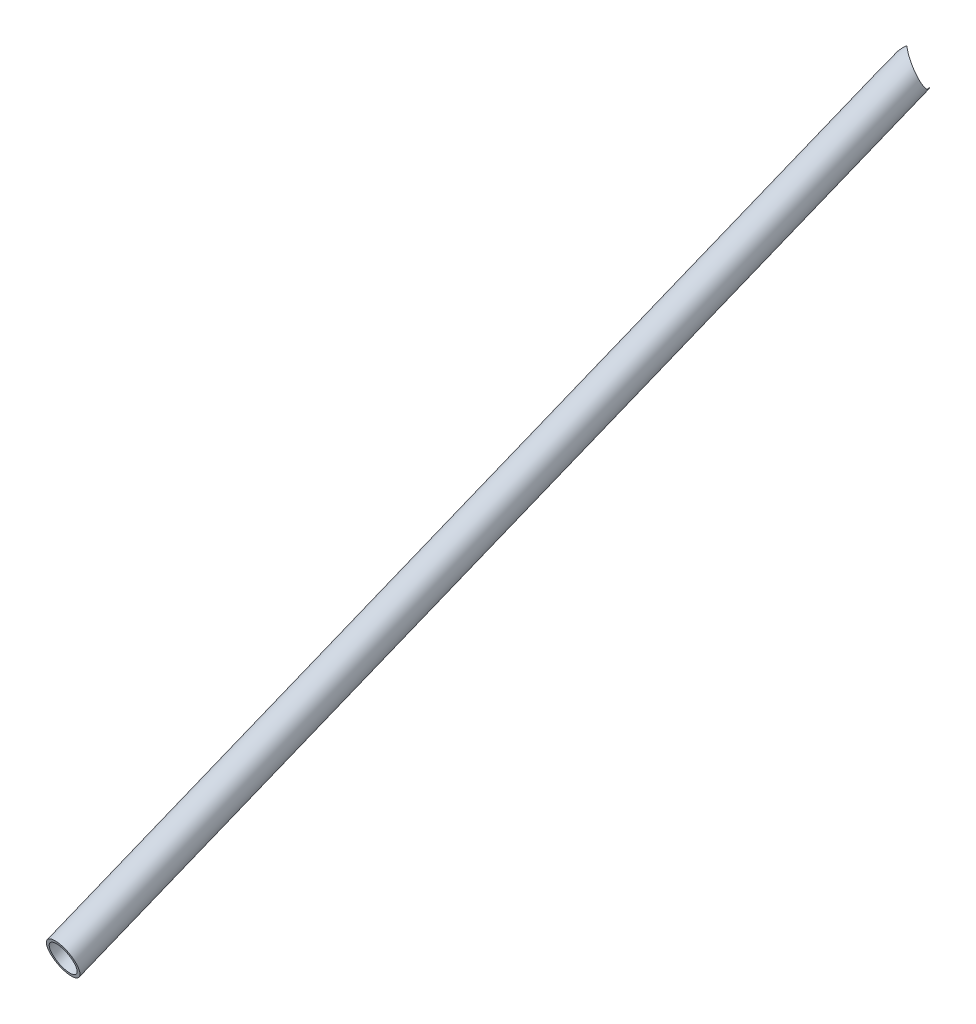
ISO-10303-21;
HEADER;
FILE_DESCRIPTION(('STEP AP214'),'2;1');
FILE_NAME('part.step','',(''),(''),'','','');
FILE_SCHEMA(('AUTOMOTIVE_DESIGN { 1 0 10303 214 1 1 1 1 }'));
ENDSEC;
DATA;
#1=APPLICATION_CONTEXT('core data for automotive mechanical design processes');
#2=APPLICATION_PROTOCOL_DEFINITION('international standard','automotive_design',2000,#1);
#3=PRODUCT_CONTEXT('',#1,'mechanical');
#4=PRODUCT('Part','Part','',(#3));
#5=PRODUCT_RELATED_PRODUCT_CATEGORY('part','',(#4));
#6=PRODUCT_DEFINITION_FORMATION('','',#4);
#7=PRODUCT_DEFINITION_CONTEXT('part definition',#1,'design');
#8=PRODUCT_DEFINITION('design','',#6,#7);
#9=PRODUCT_DEFINITION_SHAPE('','',#8);
#10=(LENGTH_UNIT() NAMED_UNIT(*) SI_UNIT(.MILLI.,.METRE.));
#11=(NAMED_UNIT(*) PLANE_ANGLE_UNIT() SI_UNIT($,.RADIAN.));
#12=(NAMED_UNIT(*) SI_UNIT($,.STERADIAN.) SOLID_ANGLE_UNIT());
#13=UNCERTAINTY_MEASURE_WITH_UNIT(LENGTH_MEASURE(1.E-05),#10,'distance_accuracy_value','');
#14=(GEOMETRIC_REPRESENTATION_CONTEXT(3) GLOBAL_UNCERTAINTY_ASSIGNED_CONTEXT((#13)) GLOBAL_UNIT_ASSIGNED_CONTEXT((#10,
#11,#12)) REPRESENTATION_CONTEXT('',''));
#15=CARTESIAN_POINT('',(0.,0.,0.));
#16=DIRECTION('',(0.,0.,1.));
#17=DIRECTION('',(1.,0.,0.));
#18=AXIS2_PLACEMENT_3D('',#15,#16,#17);
#19=CARTESIAN_POINT('',(-80.,380.,-601.037933611912));
#20=DIRECTION('',(-0.125768324689571,0.215602842324979,-0.968347945155133));
#21=DIRECTION('',(0.,0.976098519192531,0.21732850901377));
#22=AXIS2_PLACEMENT_3D('',#19,#20,#21);
#23=CYLINDRICAL_SURFACE('',#22,7.9);
#24=CARTESIAN_POINT('',(-149.209076931173,506.355310183633,-1132.19342575695));
#25=CARTESIAN_POINT('',(-148.945397748748,506.335164156304,-1132.10292983534));
#26=CARTESIAN_POINT('',(-148.683483917305,506.302315775724,-1132.00985622841));
#27=CARTESIAN_POINT('',(-148.163566693941,506.213375160184,-1131.8234688328));
#28=CARTESIAN_POINT('',(-147.905567175437,506.157261283191,-1131.7301549011));
#29=CARTESIAN_POINT('',(-147.393150377631,506.0227927718,-1131.54684993696));
#30=CARTESIAN_POINT('',(-147.138748464778,505.944362332052,-1131.45687143248));
#31=CARTESIAN_POINT('',(-146.635270418867,505.765996660557,-1131.28389953262));
#32=CARTESIAN_POINT('',(-146.38619192179,505.666071202015,-1131.20090298649));
#33=CARTESIAN_POINT('',(-145.935804247323,505.463536693041,-1131.05796775222));
#34=CARTESIAN_POINT('',(-145.733504917796,505.364203929144,-1130.99649852533));
#35=CARTESIAN_POINT('',(-145.334315271058,505.150854709887,-1130.88209634148));
#36=CARTESIAN_POINT('',(-145.137423943656,505.036841019806,-1130.82916178116));
#37=CARTESIAN_POINT('',(-144.750716376789,504.794450852289,-1130.73358029555));
#38=CARTESIAN_POINT('',(-144.560884871582,504.666108095893,-1130.69090993239));
#39=CARTESIAN_POINT('',(-144.18939505968,504.395019611466,-1130.61733841013));
#40=CARTESIAN_POINT('',(-144.007734821495,504.252277313281,-1130.58643445668));
#41=CARTESIAN_POINT('',(-143.689951671463,503.982889595417,-1130.54284101061));
#42=CARTESIAN_POINT('',(-143.552012361899,503.858771653067,-1130.52773952096));
#43=CARTESIAN_POINT('',(-143.283629265849,503.601965756527,-1130.50680881754));
#44=CARTESIAN_POINT('',(-143.153183799094,503.469279737755,-1130.50097751732));
#45=CARTESIAN_POINT('',(-142.900951024974,503.195880569679,-1130.49924839674));
#46=CARTESIAN_POINT('',(-142.779162086527,503.055168941632,-1130.50334869992));
#47=CARTESIAN_POINT('',(-142.545413655984,502.766437104493,-1130.52200663054));
#48=CARTESIAN_POINT('',(-142.433454280269,502.6184168089,-1130.53656438178));
#49=CARTESIAN_POINT('',(-142.21994845476,502.315188330065,-1130.57658944049));
#50=CARTESIAN_POINT('',(-142.118463599413,502.159944645185,-1130.60211717397));
#51=CARTESIAN_POINT('',(-141.927715379098,501.844229900909,-1130.66420029894));
#52=CARTESIAN_POINT('',(-141.838452033992,501.683758833018,-1130.70075570834));
#53=CARTESIAN_POINT('',(-141.673069237904,501.358973983735,-1130.78472601664));
#54=CARTESIAN_POINT('',(-141.59694707169,501.194661004143,-1130.83213866749));
#55=CARTESIAN_POINT('',(-141.458479748166,500.863601975269,-1130.93739959161));
#56=CARTESIAN_POINT('',(-141.396133788302,500.696856068323,-1130.99524725661));
#57=CARTESIAN_POINT('',(-141.290531241945,500.377362427451,-1131.11508102409));
#58=CARTESIAN_POINT('',(-141.246065046967,500.22469856664,-1131.17623241777));
#59=CARTESIAN_POINT('',(-141.168892651666,499.919516632509,-1131.30600387277));
#60=CARTESIAN_POINT('',(-141.136190363212,499.766998624473,-1131.37462640863));
#61=CARTESIAN_POINT('',(-141.082457967126,499.463140452781,-1131.51856313821));
#62=CARTESIAN_POINT('',(-141.061424350288,499.311799948521,-1131.59387531218));
#63=CARTESIAN_POINT('',(-141.030737011328,499.011000025401,-1131.7504455364));
#64=CARTESIAN_POINT('',(-141.021087574171,498.861541335778,-1131.83170581328));
#65=CARTESIAN_POINT('',(-141.012546068008,498.556026209601,-1132.00454634411));
#66=CARTESIAN_POINT('',(-141.014358165601,498.400135349108,-1132.09645407452));
#67=CARTESIAN_POINT('',(-141.029854091662,498.09187905772,-1132.28509554277));
#68=CARTESIAN_POINT('',(-141.04354258776,497.939515037109,-1132.38183116397));
#69=CARTESIAN_POINT('',(-141.101570054032,497.488390680734,-1132.67793262379));
#70=CARTESIAN_POINT('',(-141.162869604292,497.195530585161,-1132.8832317644));
#71=CARTESIAN_POINT('',(-141.305295357519,496.69999561904,-1133.24931974027));
#72=CARTESIAN_POINT('',(-141.377500407997,496.493228250627,-1133.40825052389));
#73=CARTESIAN_POINT('',(-141.542839244265,496.09000057644,-1133.72834151092));
#74=CARTESIAN_POINT('',(-141.635974045892,495.893540771519,-1133.88950182219));
#75=CARTESIAN_POINT('',(-141.842080026609,495.510394039454,-1134.21181336521));
#76=CARTESIAN_POINT('',(-141.955100421648,495.323732887392,-1134.37296355828));
#77=CARTESIAN_POINT('',(-142.199872377423,494.960337796786,-1134.69209078076));
#78=CARTESIAN_POINT('',(-142.331619165869,494.78360134496,-1134.85006860696));
#79=CARTESIAN_POINT('',(-142.591977597081,494.465616081082,-1135.13617826372));
#80=CARTESIAN_POINT('',(-142.718021470033,494.3230566813,-1135.26519655212));
#81=CARTESIAN_POINT('',(-142.983289241716,494.044191898699,-1135.51638141087));
#82=CARTESIAN_POINT('',(-143.122515452484,493.907887619207,-1135.6385467733));
#83=CARTESIAN_POINT('',(-143.413977822429,493.641492174093,-1135.87271729657));
#84=CARTESIAN_POINT('',(-143.566179484615,493.511385884096,-1135.98474786073));
#85=CARTESIAN_POINT('',(-143.884040917533,493.256838691608,-1136.1950500114));
#86=CARTESIAN_POINT('',(-144.049691606689,493.13239405319,-1136.29333076247));
#87=CARTESIAN_POINT('',(-144.431673226419,492.863002290753,-1136.49025468676));
#88=CARTESIAN_POINT('',(-144.65128507927,492.719331716194,-1136.58451915683));
#89=CARTESIAN_POINT('',(-144.994238640168,492.511193260405,-1136.69713275377));
#90=CARTESIAN_POINT('',(-145.110732638202,492.443083407885,-1136.72986153456));
#91=CARTESIAN_POINT('',(-145.347740314291,492.309622956683,-1136.7844922948));
#92=CARTESIAN_POINT('',(-145.468251877571,492.244270946123,-1136.80639987721));
#93=CARTESIAN_POINT('',(-145.713735983459,492.116146459075,-1136.83852556512));
#94=CARTESIAN_POINT('',(-145.838740959214,492.053406076392,-1136.84862532447));
#95=CARTESIAN_POINT('',(-146.090986260931,491.931774955897,-1136.85616787937));
#96=CARTESIAN_POINT('',(-146.218226470405,491.872884018221,-1136.85361133256));
#97=CARTESIAN_POINT('',(-146.473878791869,491.759469646823,-1136.83590061676));
#98=CARTESIAN_POINT('',(-146.602291716021,491.7049495437,-1136.82073693926));
#99=CARTESIAN_POINT('',(-146.859130287853,491.600790135383,-1136.77849237857));
#100=CARTESIAN_POINT('',(-146.987555934445,491.55115158345,-1136.75140965971));
#101=CARTESIAN_POINT('',(-147.265707297367,491.44895395763,-1136.68085553512));
#102=CARTESIAN_POINT('',(-147.415277259371,491.39737342614,-1136.6353603518));
#103=CARTESIAN_POINT('',(-147.712485594273,491.301640242753,-1136.53176123337));
#104=CARTESIAN_POINT('',(-147.860122350485,491.257493482011,-1136.47364738088));
#105=CARTESIAN_POINT('',(-148.153362512233,491.17665193975,-1136.34693406544));
#106=CARTESIAN_POINT('',(-148.298959548193,491.139977064142,-1136.27830742488));
#107=CARTESIAN_POINT('',(-148.587604613385,491.074227809513,-1136.13275573312));
#108=CARTESIAN_POINT('',(-148.730653257638,491.045151572857,-1136.05583271666));
#109=CARTESIAN_POINT('',(-149.095088073196,490.980149790487,-1135.8497929506));
#110=CARTESIAN_POINT('',(-149.314754369202,490.949734635115,-1135.71587441918));
#111=CARTESIAN_POINT('',(-149.748967460457,490.907440020065,-1135.43719698277));
#112=CARTESIAN_POINT('',(-149.963511455906,490.895570478731,-1135.29243232052));
#113=CARTESIAN_POINT('',(-150.388271628821,490.890591506467,-1134.99587598923));
#114=CARTESIAN_POINT('',(-150.598482396924,490.897504243792,-1134.84407622463));
#115=CARTESIAN_POINT('',(-151.014571720908,490.930601876499,-1134.53677863201));
#116=CARTESIAN_POINT('',(-151.220451093828,490.956783103092,-1134.38128151343));
#117=CARTESIAN_POINT('',(-151.63491919527,491.030346509279,-1134.06380550317));
#118=CARTESIAN_POINT('',(-151.843355295189,491.078430733602,-1133.90178846065));
#119=CARTESIAN_POINT('',(-152.25510265635,491.196885942441,-1133.579263829));
#120=CARTESIAN_POINT('',(-152.458413089686,491.267260502742,-1133.41875648631));
#121=CARTESIAN_POINT('',(-152.85841688323,491.431082898503,-1133.10230184369));
#122=CARTESIAN_POINT('',(-153.055124457694,491.524477002702,-1132.94634485732));
#123=CARTESIAN_POINT('',(-153.440879652212,491.73529147226,-1132.64138840613));
#124=CARTESIAN_POINT('',(-153.629930739531,491.852700813136,-1132.49238578724));
#125=CARTESIAN_POINT('',(-153.945003538001,492.074505943271,-1132.24598469193));
#126=CARTESIAN_POINT('',(-154.07341912193,492.172818738895,-1132.14614126874));
#127=CARTESIAN_POINT('',(-154.324536692384,492.381883723608,-1131.95250292141));
#128=CARTESIAN_POINT('',(-154.447240106983,492.492632779679,-1131.85870648321));
#129=CARTESIAN_POINT('',(-154.685948426336,492.72638837782,-1131.67828730847));
#130=CARTESIAN_POINT('',(-154.801956475166,492.849389091434,-1131.59166119638));
#131=CARTESIAN_POINT('',(-155.026329669747,493.107318693739,-1131.42660466953));
#132=CARTESIAN_POINT('',(-155.134694620051,493.242247887261,-1131.34817446433));
#133=CARTESIAN_POINT('',(-155.343339827644,493.524177806421,-1131.20009774587));
#134=CARTESIAN_POINT('',(-155.443570762874,493.671242637597,-1131.13050355555));
#135=CARTESIAN_POINT('',(-155.634260707129,493.975819868981,-1131.00150755349));
#136=CARTESIAN_POINT('',(-155.724719728831,494.133332255634,-1130.94210572852));
#137=CARTESIAN_POINT('',(-155.894968621199,494.457547669169,-1130.83419009648));
#138=CARTESIAN_POINT('',(-155.974760346702,494.624249091115,-1130.78567439552));
#139=CARTESIAN_POINT('',(-156.122984995812,494.965419587952,-1130.69995821525));
#140=CARTESIAN_POINT('',(-156.191418595659,495.139888199613,-1130.66275706218));
#141=CARTESIAN_POINT('',(-156.31095450939,495.479416779801,-1130.60259233615));
#142=CARTESIAN_POINT('',(-156.363050736634,495.643958793976,-1130.57866581456));
#143=CARTESIAN_POINT('',(-156.457210655442,495.977025963757,-1130.5402772006));
#144=CARTESIAN_POINT('',(-156.499270944619,496.145552448959,-1130.52581831506));
#145=CARTESIAN_POINT('',(-156.57327436628,496.485272519591,-1130.50613851326));
#146=CARTESIAN_POINT('',(-156.605220840796,496.656465204337,-1130.50091454277));
#147=CARTESIAN_POINT('',(-156.659112704467,497.000507686616,-1130.49930518215));
#148=CARTESIAN_POINT('',(-156.681054323077,497.173358083879,-1130.50292312101));
#149=CARTESIAN_POINT('',(-156.71598623703,497.528578896608,-1130.51891002928));
#150=CARTESIAN_POINT('',(-156.728456554286,497.710980565861,-1130.53172067157));
#151=CARTESIAN_POINT('',(-156.742839311385,498.075419778843,-1130.5658940148));
#152=CARTESIAN_POINT('',(-156.744747582262,498.257457150444,-1130.58726008909));
#153=CARTESIAN_POINT('',(-156.735131828409,498.80173935033,-1130.66312793042));
#154=CARTESIAN_POINT('',(-156.708274610811,499.162232834629,-1130.72940341452));
#155=CARTESIAN_POINT('',(-156.629154242411,499.774869451036,-1130.86532058073));
#156=CARTESIAN_POINT('',(-156.585873407152,500.029625590335,-1130.92905952041));
#157=CARTESIAN_POINT('',(-156.480163475416,500.532302352704,-1131.06728099715));
#158=CARTESIAN_POINT('',(-156.417726478756,500.780220109496,-1131.14176796008));
#159=CARTESIAN_POINT('',(-156.274144813257,501.268420820778,-1131.29906927404));
#160=CARTESIAN_POINT('',(-156.19296169953,501.50868691477,-1131.38190053818));
#161=CARTESIAN_POINT('',(-156.012133890568,501.98009255231,-1131.55301055264));
#162=CARTESIAN_POINT('',(-155.912493962406,502.211234433824,-1131.64128789242));
#163=CARTESIAN_POINT('',(-155.712903327409,502.625072195093,-1131.8049838945));
#164=CARTESIAN_POINT('',(-155.615879841246,502.809328480998,-1131.88003992814));
#165=CARTESIAN_POINT('',(-155.408290846577,503.170330168936,-1132.02966044137));
#166=CARTESIAN_POINT('',(-155.29772340105,503.347074491747,-1132.10422484904));
#167=CARTESIAN_POINT('',(-155.062495657227,503.691723499838,-1132.25008640755));
#168=CARTESIAN_POINT('',(-154.937869961075,503.85964846001,-1132.32139099864));
#169=CARTESIAN_POINT('',(-154.673396838947,504.185649506919,-1132.45763802183));
#170=CARTESIAN_POINT('',(-154.533558807739,504.343731578587,-1132.52258433408));
#171=CARTESIAN_POINT('',(-154.200028021403,504.686678568786,-1132.65724224499));
#172=CARTESIAN_POINT('',(-154.001637360214,504.868275572277,-1132.72404179728));
#173=CARTESIAN_POINT('',(-153.684812201544,505.12219683196,-1132.80510143005));
#174=CARTESIAN_POINT('',(-153.576083764801,505.203705369792,-1132.82892092326));
#175=CARTESIAN_POINT('',(-153.352474301204,505.359773269876,-1132.8691519406));
#176=CARTESIAN_POINT('',(-153.237596462355,505.434336179015,-1132.88556726241));
#177=CARTESIAN_POINT('',(-153.001233663215,505.576294274305,-1132.91026708044));
#178=CARTESIAN_POINT('',(-152.879699019072,505.643619798931,-1132.91847794908));
#179=CARTESIAN_POINT('',(-152.631942356173,505.769584173739,-1132.926070916));
#180=CARTESIAN_POINT('',(-152.505720507048,505.828223337896,-1132.92545333346));
#181=CARTESIAN_POINT('',(-152.249560295163,505.936432114302,-1132.91546494841));
#182=CARTESIAN_POINT('',(-152.119616408,505.98598734114,-1132.90608040328));
#183=CARTESIAN_POINT('',(-151.857395677946,506.075798498677,-1132.87912838917));
#184=CARTESIAN_POINT('',(-151.725118528684,506.116053198226,-1132.86155983776));
#185=CARTESIAN_POINT('',(-151.43247783492,506.194654963883,-1132.81491356437));
#186=CARTESIAN_POINT('',(-151.271829175755,506.230980663894,-1132.78422944566));
#187=CARTESIAN_POINT('',(-150.950034031059,506.291232816449,-1132.71438758025));
#188=CARTESIAN_POINT('',(-150.78888733547,506.315153011981,-1132.6752255716));
#189=CARTESIAN_POINT('',(-150.46699636012,506.351521783464,-1132.59043077151));
#190=CARTESIAN_POINT('',(-150.306252218802,506.363966841935,-1132.54479600091));
#191=CARTESIAN_POINT('',(-149.985765495112,506.378294800517,-1132.44888921098));
#192=CARTESIAN_POINT('',(-149.826022580448,506.380181412916,-1132.39861882782));
#193=CARTESIAN_POINT('',(-149.590273684241,506.375755685303,-1132.32184994395));
#194=CARTESIAN_POINT('',(-149.513786303038,506.373186581083,-1132.29653725549));
#195=CARTESIAN_POINT('',(-149.361176242589,506.365865309267,-1132.24536263483));
#196=CARTESIAN_POINT('',(-149.285053303334,506.361115048681,-1132.2195012012));
#197=CARTESIAN_POINT('',(-149.209076931173,506.355310183633,-1132.19342575695));
#198=B_SPLINE_CURVE_WITH_KNOTS('',3,(#24,#25,#26,#27,#28,#29,#30,#31,#32,#33,#34,#35,#36,#37,
#38,#39,#40,#41,#42,#43,#44,#45,#46,#47,#48,#49,#50,#51,#52,#53,#54,#55,#56,#57,#58,#59,#60,#61,
#62,#63,#64,#65,#66,#67,#68,#69,#70,#71,#72,#73,#74,#75,#76,#77,#78,#79,#80,#81,#82,#83,#84,#85,
#86,#87,#88,#89,#90,#91,#92,#93,#94,#95,#96,#97,#98,#99,#100,#101,#102,#103,#104,#105,#106,#107,
#108,#109,#110,#111,#112,#113,#114,#115,#116,#117,#118,#119,#120,#121,#122,#123,#124,#125,#126,
#127,#128,#129,#130,#131,#132,#133,#134,#135,#136,#137,#138,#139,#140,#141,#142,#143,#144,#145,
#146,#147,#148,#149,#150,#151,#152,#153,#154,#155,#156,#157,#158,#159,#160,#161,#162,#163,#164,
#165,#166,#167,#168,#169,#170,#171,#172,#173,#174,#175,#176,#177,#178,#179,#180,#181,#182,#183,
#184,#185,#186,#187,#188,#189,#190,#191,#192,#193,#194,#195,#196,#197),.UNSPECIFIED.,.T.,.F.,(4,
2,2,2,2,2,2,2,2,2,2,2,2,2,2,2,2,2,2,2,2,2,2,2,2,2,2,2,2,2,2,2,2,2,2,2,2,2,2,2,2,2,2,2,2,2,2,2,2,
2,2,2,2,2,2,2,2,2,2,2,2,2,2,2,2,2,2,2,2,2,2,2,2,2,2,2,2,2,2,2,2,2,2,2,2,2,4),(0.,
0.838433213144828,1.67764810983498,2.51974841481425,3.36146664572762,4.06165677740792,
4.76171521465335,5.46015959130429,6.15843799559853,6.71642980681585,7.27429601276408,
7.83205682409143,8.38982423830972,8.95070420072674,9.51158507469161,10.0723499203886,
10.633082089281,11.1435922006334,11.6542719161138,12.1647979677995,12.675516118492,
13.2179038075874,13.7605047610429,14.8454753704008,15.6563479236443,16.4672598415033,
17.2802077093075,18.0929487732593,18.7821436375039,19.4714596036552,20.1589969046835,
20.8460737409465,21.6794482673275,22.0955968415312,22.5115297177716,22.9315965618223,
23.3516415785743,23.7720036883173,24.1924305618834,24.6855370043288,25.1790324059055,
25.6738258191042,26.1684981570422,26.9445239466122,27.7209646191389,28.4983221032063,
29.2755316138984,30.0796259546553,30.88384935253,31.6862130534611,32.4882092430721,
33.05787715746,33.6274018783201,34.1966569427762,34.7659265586918,35.3384238131807,
35.9109203249157,36.4833171607012,37.0556799048081,37.5778139440901,38.10012474673,
38.6222627752601,39.1445974204968,39.6938691141107,40.2433575963775,41.3420996517909,
42.1396561189603,42.9375419491451,43.7370788643106,44.5364095602879,45.19997580061,
45.863637053478,46.5256990559886,47.1873544816264,48.0154758849219,48.4289326550972,
48.8421771165706,49.2590976374242,49.6760030846335,50.0935631488571,50.511178455679,
51.0130018868851,51.5150781791729,52.0173083221061,52.5193618727529,52.7611585539233,
53.0027442310614),.UNSPECIFIED.);
#199=CARTESIAN_POINT('',(-147.051637621689,505.911837145396,-1131.42729222496));
#200=VERTEX_POINT('',#199);
#201=CARTESIAN_POINT('',(-141.210672803132,497.034089907992,-1133.00317995123));
#202=VERTEX_POINT('',#201);
#203=EDGE_CURVE('E110',#200,#202,#198,.T.);
#204=ORIENTED_EDGE('',*,*,#203,.T.);
#205=CARTESIAN_POINT('',(-148.940567607682,505.895008486219,-1130.12604947362));
#206=CARTESIAN_POINT('',(-148.797369414708,505.922427252075,-1130.24920348744));
#207=CARTESIAN_POINT('',(-148.64978728518,505.944149474872,-1130.3685906793));
#208=CARTESIAN_POINT('',(-148.347314700426,505.974873234051,-1130.59961550632));
#209=CARTESIAN_POINT('',(-148.192420889959,505.983868870554,-1130.71124952441));
#210=CARTESIAN_POINT('',(-147.87690960368,505.988120989996,-1130.92694844146));
#211=CARTESIAN_POINT('',(-147.716283630587,505.983356161591,-1131.03100134351));
#212=CARTESIAN_POINT('',(-147.391500625244,505.959381140702,-1131.23161788331));
#213=CARTESIAN_POINT('',(-147.227343931167,505.940172325736,-1131.32818223426));
#214=CARTESIAN_POINT('',(-146.897806628664,505.887048967359,-1131.51407369267));
#215=CARTESIAN_POINT('',(-146.732429435695,505.853166323165,-1131.60341600289));
#216=CARTESIAN_POINT('',(-146.401970657371,505.770673729594,-1131.77561006596));
#217=CARTESIAN_POINT('',(-146.236889082139,505.722063285228,-1131.85846160054));
#218=CARTESIAN_POINT('',(-145.908768820898,505.610322567362,-1132.01818305342));
#219=CARTESIAN_POINT('',(-145.745730115527,505.547192431587,-1132.09505302845));
#220=CARTESIAN_POINT('',(-145.42327445945,505.406796231344,-1132.24327003116));
#221=CARTESIAN_POINT('',(-145.263857542653,505.329530034587,-1132.31461700715));
#222=CARTESIAN_POINT('',(-144.947455243891,505.159978697002,-1132.45329634111));
#223=CARTESIAN_POINT('',(-144.790554363032,505.067465196928,-1132.52054222362));
#224=CARTESIAN_POINT('',(-144.483294026022,504.869008648357,-1132.64996148608));
#225=CARTESIAN_POINT('',(-144.332934616114,504.763065504944,-1132.71213483018));
#226=CARTESIAN_POINT('',(-144.039921328808,504.538466122195,-1132.83153671005));
#227=CARTESIAN_POINT('',(-143.89726824345,504.419808579825,-1132.88876473792));
#228=CARTESIAN_POINT('',(-143.620724948532,504.170583059189,-1132.99824639619));
#229=CARTESIAN_POINT('',(-143.486834948512,504.040014796296,-1133.05049990764));
#230=CARTESIAN_POINT('',(-143.223200612685,503.761983653608,-1133.15199283751));
#231=CARTESIAN_POINT('',(-143.093879774377,503.61403657247,-1133.20100714986));
#232=CARTESIAN_POINT('',(-142.846661904512,503.307146035781,-1133.2930765503));
#233=CARTESIAN_POINT('',(-142.728765220959,503.1482022455,-1133.33613145687));
#234=CARTESIAN_POINT('',(-142.505128034293,502.82038611162,-1133.41574780354));
#235=CARTESIAN_POINT('',(-142.399390228559,502.651511577452,-1133.45230780376));
#236=CARTESIAN_POINT('',(-142.200710701949,502.305048744243,-1133.51820364745));
#237=CARTESIAN_POINT('',(-142.107768905655,502.127460496567,-1133.5475395335));
#238=CARTESIAN_POINT('',(-141.934706952428,501.763953001763,-1133.59822050946));
#239=CARTESIAN_POINT('',(-141.854651803271,501.577997220528,-1133.61952577013));
#240=CARTESIAN_POINT('',(-141.708189837887,501.199971704908,-1133.6528745586));
#241=CARTESIAN_POINT('',(-141.641783154198,501.007901911171,-1133.66491799646));
#242=CARTESIAN_POINT('',(-141.522704560669,500.619264786748,-1133.6785360788));
#243=CARTESIAN_POINT('',(-141.470027140153,500.42269929512,-1133.68011492981));
#244=CARTESIAN_POINT('',(-141.378185695515,500.026686223088,-1133.67152740652));
#245=CARTESIAN_POINT('',(-141.339021074338,499.827238770427,-1133.66136155124));
#246=CARTESIAN_POINT('',(-141.274844479682,499.434179715189,-1133.62857608658));
#247=CARTESIAN_POINT('',(-141.249392076831,499.240603325303,-1133.60639682913));
#248=CARTESIAN_POINT('',(-141.20991082293,498.854247282592,-1133.54884845809));
#249=CARTESIAN_POINT('',(-141.195881490714,498.661467596547,-1133.51347990016));
#250=CARTESIAN_POINT('',(-141.178229665583,498.278623063427,-1133.42877553436));
#251=CARTESIAN_POINT('',(-141.174601713757,498.088556844393,-1133.37944706795));
#252=CARTESIAN_POINT('',(-141.176445156004,497.71280852557,-1133.26639255519));
#253=CARTESIAN_POINT('',(-141.181916284432,497.527126297953,-1133.2026669292));
#254=CARTESIAN_POINT('',(-141.199991111386,497.170983820304,-1133.06446419581));
#255=CARTESIAN_POINT('',(-141.212219787716,497.000228800852,-1132.99069451131));
#256=CARTESIAN_POINT('',(-141.242171716653,496.665165037871,-1132.8306778792));
#257=CARTESIAN_POINT('',(-141.259895511493,496.500856932296,-1132.74442970071));
#258=CARTESIAN_POINT('',(-141.29949421581,496.179520886091,-1132.56030138723));
#259=CARTESIAN_POINT('',(-141.321367572148,496.022490248852,-1132.46242560943));
#260=CARTESIAN_POINT('',(-141.368054606409,495.716027469012,-1132.25607391203));
#261=CARTESIAN_POINT('',(-141.392868692037,495.566596384132,-1132.14759652298));
#262=CARTESIAN_POINT('',(-141.459577598408,495.189460967409,-1131.8543900974));
#263=CARTESIAN_POINT('',(-141.502910802173,494.967604174588,-1131.66243979308));
#264=CARTESIAN_POINT('',(-141.591136843048,494.542271653954,-1131.25948457444));
#265=CARTESIAN_POINT('',(-141.63603068204,494.338808047416,-1131.04846727529));
#266=CARTESIAN_POINT('',(-141.725577695923,493.947541726514,-1130.61075482551));
#267=CARTESIAN_POINT('',(-141.770229012767,493.759809924345,-1130.38399631451));
#268=CARTESIAN_POINT('',(-141.836034950464,493.489086188484,-1130.03537919487));
#269=CARTESIAN_POINT('',(-141.857772466885,493.400667562456,-1129.91777537305));
#270=CARTESIAN_POINT('',(-141.900791459665,493.227157621689,-1129.6800569809));
#271=CARTESIAN_POINT('',(-141.922072944377,493.142066245984,-1129.55994245664));
#272=CARTESIAN_POINT('',(-141.984452217828,492.894143331158,-1129.20030726919));
#273=CARTESIAN_POINT('',(-142.024814091936,492.735697733801,-1128.95762910983));
#274=CARTESIAN_POINT('',(-142.103383464394,492.428825856873,-1128.46564876398));
#275=CARTESIAN_POINT('',(-142.141590423903,492.280402081463,-1128.21634494345));
#276=CARTESIAN_POINT('',(-142.215905968941,491.99194382083,-1127.71232546772));
#277=CARTESIAN_POINT('',(-142.252012543842,491.851917370245,-1127.45760493566));
#278=CARTESIAN_POINT('',(-142.32221012857,491.579146926527,-1126.94406411295));
#279=CARTESIAN_POINT('',(-142.356301296251,491.446402363109,-1126.6852441454));
#280=CARTESIAN_POINT('',(-142.422762551751,491.186673962578,-1126.16335498501));
#281=CARTESIAN_POINT('',(-142.455126074825,491.059712335277,-1125.90027393819));
#282=CARTESIAN_POINT('',(-142.518192259097,490.811193147744,-1125.37136907477));
#283=CARTESIAN_POINT('',(-142.54889484283,490.689635839612,-1125.10554513091));
#284=CARTESIAN_POINT('',(-142.638770520778,490.332098235262,-1124.30497379349));
#285=CARTESIAN_POINT('',(-142.695746121279,490.103117141864,-1123.76685107126));
#286=CARTESIAN_POINT('',(-142.80569666036,489.6577696683,-1122.67985903291));
#287=CARTESIAN_POINT('',(-142.858634883452,489.441522387596,-1122.13093774747));
#288=CARTESIAN_POINT('',(-142.961219044614,489.020747234548,-1121.02827307419));
#289=CARTESIAN_POINT('',(-143.010864668961,488.8162204792,-1120.47452923252));
#290=CARTESIAN_POINT('',(-143.107765110095,488.417283803424,-1119.36454894001));
#291=CARTESIAN_POINT('',(-143.155024767688,488.222853373956,-1118.80832025209));
#292=CARTESIAN_POINT('',(-143.248094597503,487.842216178683,-1117.69293183506));
#293=CARTESIAN_POINT('',(-143.293904742913,487.656009564973,-1117.13377205195));
#294=CARTESIAN_POINT('',(-143.397464900477,487.239789411558,-1115.85650288489));
#295=CARTESIAN_POINT('',(-143.45497533591,487.012069828328,-1115.13762709229));
#296=CARTESIAN_POINT('',(-143.569989605058,486.566993847248,-1113.69666817028));
#297=CARTESIAN_POINT('',(-143.627493438634,486.349637639051,-1112.97458498245));
#298=CARTESIAN_POINT('',(-143.743576741472,485.924300668945,-1111.52723074814));
#299=CARTESIAN_POINT('',(-143.802156894676,485.716326180519,-1110.80195791429));
#300=CARTESIAN_POINT('',(-143.92130710311,485.309463319159,-1109.34903845602));
#301=CARTESIAN_POINT('',(-143.981877141383,485.110574868838,-1108.62139185188));
#302=CARTESIAN_POINT('',(-144.105562991686,484.722918249507,-1107.16821636468));
#303=CARTESIAN_POINT('',(-144.168661818743,484.534097637013,-1106.44270003287));
#304=CARTESIAN_POINT('',(-144.298666429596,484.165536381061,-1104.98969353498));
#305=CARTESIAN_POINT('',(-144.365572253026,483.985795832166,-1104.26220334841));
#306=CARTESIAN_POINT('',(-144.504194481471,483.635978742745,-1102.80561015213));
#307=CARTESIAN_POINT('',(-144.575909298609,483.46589904624,-1102.07650775088));
#308=CARTESIAN_POINT('',(-144.725373105464,483.136244926503,-1100.61655944534));
#309=CARTESIAN_POINT('',(-144.803121930868,482.976670217426,-1099.88571358904));
#310=CARTESIAN_POINT('',(-144.96629110549,482.669211805148,-1098.42129057842));
#311=CARTESIAN_POINT('',(-145.051722417534,482.521345393627,-1097.68771100011));
#312=CARTESIAN_POINT('',(-145.232203834873,482.239670713776,-1096.21881789132));
#313=CARTESIAN_POINT('',(-145.32725611748,482.105865641678,-1095.48350400528));
#314=CARTESIAN_POINT('',(-145.479430515954,481.918153571603,-1094.37846258485));
#315=CARTESIAN_POINT('',(-145.531842715588,481.857665796001,-1094.00920058606));
#316=CARTESIAN_POINT('',(-145.640369865379,481.741768070247,-1093.27042753562));
#317=CARTESIAN_POINT('',(-145.696484713216,481.686357979879,-1092.90091649115));
#318=CARTESIAN_POINT('',(-145.813057618214,481.581465023589,-1092.16189685602));
#319=CARTESIAN_POINT('',(-145.873513802209,481.531979625622,-1091.7923883323));
#320=CARTESIAN_POINT('',(-145.999675717959,481.44004448111,-1091.05340276115));
#321=CARTESIAN_POINT('',(-146.065381095225,481.39759426006,-1090.68392571329));
#322=CARTESIAN_POINT('',(-146.20356053873,481.321174003026,-1089.94374813665));
#323=CARTESIAN_POINT('',(-146.276061458286,481.287239741737,-1089.57304886272));
#324=CARTESIAN_POINT('',(-146.429447095989,481.230434786836,-1088.83218585121));
#325=CARTESIAN_POINT('',(-146.510337750109,481.207571992331,-1088.4620226833));
#326=CARTESIAN_POINT('',(-146.639917824001,481.184568300188,-1087.90888444309));
#327=CARTESIAN_POINT('',(-146.684404750998,481.178782446976,-1087.72515861265));
#328=CARTESIAN_POINT('',(-146.776685539889,481.171685015139,-1087.35845976054));
#329=CARTESIAN_POINT('',(-146.824479043319,481.170372952285,-1087.17548665952));
#330=CARTESIAN_POINT('',(-146.923993424426,481.1731874034,-1086.81087205666));
#331=CARTESIAN_POINT('',(-146.975709620064,481.177307526982,-1086.62922924248));
#332=CARTESIAN_POINT('',(-147.084031175285,481.192329359011,-1086.2677124636));
#333=CARTESIAN_POINT('',(-147.140634754971,481.20322860752,-1086.08783788129));
#334=CARTESIAN_POINT('',(-147.235380593014,481.227505411747,-1085.80470423071));
#335=CARTESIAN_POINT('',(-147.271480315469,481.237995385785,-1085.70051513495));
#336=CARTESIAN_POINT('',(-147.346205794819,481.262589924971,-1085.49343600056));
#337=CARTESIAN_POINT('',(-147.384832134036,481.276695325587,-1085.39054626796));
#338=CARTESIAN_POINT('',(-147.465013410502,481.309242484626,-1085.18672811652));
#339=CARTESIAN_POINT('',(-147.506564946782,481.327679263649,-1085.08579758854));
#340=CARTESIAN_POINT('',(-147.59319885369,481.369882655359,-1084.88662817662));
#341=CARTESIAN_POINT('',(-147.63827946006,481.393646615809,-1084.78838798046));
#342=CARTESIAN_POINT('',(-147.738203267601,481.450981269875,-1084.58461429947));
#343=CARTESIAN_POINT('',(-147.793572194755,481.485370570477,-1084.47955958491));
#344=CARTESIAN_POINT('',(-147.910849695837,481.564956999771,-1084.27732006912));
#345=CARTESIAN_POINT('',(-147.972752559825,481.61014473477,-1084.18012852544));
#346=CARTESIAN_POINT('',(-148.08649710895,481.700424620918,-1084.02336864892));
#347=CARTESIAN_POINT('',(-148.136576594275,481.742283802453,-1083.96070581278));
#348=CARTESIAN_POINT('',(-148.24077532186,481.834539222988,-1083.8458793215));
#349=CARTESIAN_POINT('',(-148.294885982195,481.884917600573,-1083.7936941894));
#350=CARTESIAN_POINT('',(-148.396012428721,481.984334040158,-1083.71204757741));
#351=CARTESIAN_POINT('',(-148.442498377639,482.031908651776,-1083.68017081725));
#352=CARTESIAN_POINT('',(-148.536468397759,482.132126070056,-1083.62794278926));
#353=CARTESIAN_POINT('',(-148.583951707071,482.184765110686,-1083.60758303344));
#354=CARTESIAN_POINT('',(-148.678475520978,482.293577097574,-1083.57919786128));
#355=CARTESIAN_POINT('',(-148.725516196816,482.349748606649,-1083.57116746211));
#356=CARTESIAN_POINT('',(-148.817934492643,482.463881949531,-1083.56678232242));
#357=CARTESIAN_POINT('',(-148.863310291704,482.521845622929,-1083.57044000183));
#358=CARTESIAN_POINT('',(-148.970754759653,482.663249384268,-1083.59162249994));
#359=CARTESIAN_POINT('',(-149.031535843326,482.746844310701,-1083.61446986283));
#360=CARTESIAN_POINT('',(-149.147592830601,482.91222975786,-1083.67546625771));
#361=CARTESIAN_POINT('',(-149.202853214592,482.994014715016,-1083.71365699039));
#362=CARTESIAN_POINT('',(-149.30481017572,483.149540389685,-1083.79804713998));
#363=CARTESIAN_POINT('',(-149.351831241968,483.223455788875,-1083.84355170617));
#364=CARTESIAN_POINT('',(-149.442096905124,483.368919329288,-1083.9416263748));
#365=CARTESIAN_POINT('',(-149.485337840184,483.440465134299,-1083.99420320578));
#366=CARTESIAN_POINT('',(-149.568679205977,483.581446066889,-1084.10479075175));
#367=CARTESIAN_POINT('',(-149.608771633711,483.650875557716,-1084.16281454013));
#368=CARTESIAN_POINT('',(-149.68617002013,483.787622971566,-1084.28295319506));
#369=CARTESIAN_POINT('',(-149.723477189321,483.85494180444,-1084.34506626201));
#370=CARTESIAN_POINT('',(-149.821617686654,484.035284549803,-1084.51818177727));
#371=CARTESIAN_POINT('',(-149.880166479897,484.146515926056,-1084.63234166916));
#372=CARTESIAN_POINT('',(-149.991888246692,484.364541257196,-1084.86737811276));
#373=CARTESIAN_POINT('',(-150.045057860276,484.471332414385,-1084.98825879029));
#374=CARTESIAN_POINT('',(-150.147151267099,484.68138990811,-1085.23521345812));
#375=CARTESIAN_POINT('',(-150.196066388383,484.784648796525,-1085.36129731734));
#376=CARTESIAN_POINT('',(-150.290310385226,484.988016983577,-1085.61729240313));
#377=CARTESIAN_POINT('',(-150.335638827793,485.088125901066,-1085.74720408921));
#378=CARTESIAN_POINT('',(-150.423512516326,485.286172037468,-1086.01075967108));
#379=CARTESIAN_POINT('',(-150.466041503304,485.384094701483,-1086.14441986692));
#380=CARTESIAN_POINT('',(-150.54849366295,485.577580483531,-1086.41423180336));
#381=CARTESIAN_POINT('',(-150.58841670437,485.67314348257,-1086.55038366901));
#382=CARTESIAN_POINT('',(-150.665946338896,485.862067791209,-1086.82455730477));
#383=CARTESIAN_POINT('',(-150.703556089523,485.955431989505,-1086.96257619756));
#384=CARTESIAN_POINT('',(-150.776787583489,486.140327273399,-1087.2403468245));
#385=CARTESIAN_POINT('',(-150.812409390262,486.231858417431,-1087.38009850318));
#386=CARTESIAN_POINT('',(-150.929717741568,486.53815651969,-1087.85443910259));
#387=CARTESIAN_POINT('',(-151.007330459702,486.749159833054,-1088.19247254711));
#388=CARTESIAN_POINT('',(-151.154809098246,487.163985910139,-1088.87460363302));
#389=CARTESIAN_POINT('',(-151.224673733643,487.367807478961,-1089.21870226938));
#390=CARTESIAN_POINT('',(-151.358081665844,487.769674722129,-1089.91170112285));
#391=CARTESIAN_POINT('',(-151.421621656798,487.967717338025,-1090.26060374365));
#392=CARTESIAN_POINT('',(-151.543337487645,488.358890884575,-1090.96208139018));
#393=CARTESIAN_POINT('',(-151.601513151357,488.552021653758,-1091.3146565361));
#394=CARTESIAN_POINT('',(-151.713353885529,488.934538486057,-1092.02361517168));
#395=CARTESIAN_POINT('',(-151.767008166396,489.123914810402,-1092.38000560438));
#396=CARTESIAN_POINT('',(-151.870198663544,489.499025909739,-1093.09529010493));
#397=CARTESIAN_POINT('',(-151.919734824077,489.684760635406,-1093.45418420659));
#398=CARTESIAN_POINT('',(-152.062788049402,490.237085575758,-1094.53380019742));
#399=CARTESIAN_POINT('',(-152.150786129951,490.598922047251,-1095.2576901189));
#400=CARTESIAN_POINT('',(-152.314263014593,491.312080835589,-1096.71066743756));
#401=CARTESIAN_POINT('',(-152.389759904433,491.663417728092,-1097.43974570626));
#402=CARTESIAN_POINT('',(-152.529767495008,492.358049378699,-1098.90282994726));
#403=CARTESIAN_POINT('',(-152.594277372987,492.701343532869,-1099.63683628431));
#404=CARTESIAN_POINT('',(-152.713030958827,493.380910391664,-1101.10782887808));
#405=CARTESIAN_POINT('',(-152.767286965669,493.717191072088,-1101.84481046791));
#406=CARTESIAN_POINT('',(-152.865965320412,494.384327915143,-1103.3218490815));
#407=CARTESIAN_POINT('',(-152.91038795994,494.715184238373,-1104.0619060134));
#408=CARTESIAN_POINT('',(-152.99613532336,495.428960896601,-1105.67182210844));
#409=CARTESIAN_POINT('',(-153.035617351872,495.811062777877,-1106.54214288806));
#410=CARTESIAN_POINT('',(-153.100208899842,496.570849679982,-1108.28551416864));
#411=CARTESIAN_POINT('',(-153.125314628531,496.948533510158,-1109.15856532859));
#412=CARTESIAN_POINT('',(-153.159378768463,497.701120095386,-1110.9068760937));
#413=CARTESIAN_POINT('',(-153.168326689865,498.076020886509,-1111.78213676438));
#414=CARTESIAN_POINT('',(-153.167171066299,498.637250777005,-1113.09539278043));
#415=CARTESIAN_POINT('',(-153.164357168215,498.82412403223,-1113.53316685326));
#416=CARTESIAN_POINT('',(-153.153249903009,499.197726592311,-1114.40870918287));
#417=CARTESIAN_POINT('',(-153.144956562854,499.384455897871,-1114.84647743966));
#418=CARTESIAN_POINT('',(-153.123642881568,499.732983062008,-1115.66320661424));
#419=CARTESIAN_POINT('',(-153.111404296012,499.894770909728,-1116.04219201082));
#420=CARTESIAN_POINT('',(-153.081576435435,500.21855739781,-1116.79986083635));
#421=CARTESIAN_POINT('',(-153.063987221418,500.380556035747,-1117.17854426868));
#422=CARTESIAN_POINT('',(-153.022614678478,500.70500344377,-1117.93562252481));
#423=CARTESIAN_POINT('',(-152.998828076438,500.867452406702,-1118.31401708982));
#424=CARTESIAN_POINT('',(-152.943992720033,501.192855282925,-1119.07006252032));
#425=CARTESIAN_POINT('',(-152.912944091369,501.355809187427,-1119.44771339857));
#426=CARTESIAN_POINT('',(-152.842250650781,501.682070325559,-1120.20132613279));
#427=CARTESIAN_POINT('',(-152.802620057081,501.845376537671,-1120.57728974494));
#428=CARTESIAN_POINT('',(-152.712913877816,502.172672014584,-1121.32773112705));
#429=CARTESIAN_POINT('',(-152.662837380697,502.336661337773,-1121.70220876443));
#430=CARTESIAN_POINT('',(-152.549888091796,502.665069219232,-1122.44865706072));
#431=CARTESIAN_POINT('',(-152.487026892375,502.829487256384,-1122.82062967758));
#432=CARTESIAN_POINT('',(-152.345306912318,503.158514778189,-1123.5613897165));
#433=CARTESIAN_POINT('',(-152.266452069227,503.323124205826,-1123.93017789929));
#434=CARTESIAN_POINT('',(-152.109793947715,503.612273388928,-1124.5753042317));
#435=CARTESIAN_POINT('',(-152.036271044052,503.736958187398,-1124.85260952458));
#436=CARTESIAN_POINT('',(-151.875072191289,503.985195233816,-1125.40370361073));
#437=CARTESIAN_POINT('',(-151.787394004662,504.108747299444,-1125.67749184067));
#438=CARTESIAN_POINT('',(-151.595073602665,504.353343563531,-1126.22003569054));
#439=CARTESIAN_POINT('',(-151.490441680131,504.474389233681,-1126.4887942543));
#440=CARTESIAN_POINT('',(-151.260870146383,504.711949059488,-1127.01957506687));
#441=CARTESIAN_POINT('',(-151.135938246828,504.828464915205,-1127.28159983014));
#442=CARTESIAN_POINT('',(-150.89831480713,505.024068910762,-1127.72872107899));
#443=CARTESIAN_POINT('',(-150.791053169453,505.104937816626,-1127.91591693663));
#444=CARTESIAN_POINT('',(-150.562351023746,505.260642487532,-1128.28416173694));
#445=CARTESIAN_POINT('',(-150.440909050465,505.335477627753,-1128.46521004188));
#446=CARTESIAN_POINT('',(-150.183447301833,505.476585524519,-1128.81914558921));
#447=CARTESIAN_POINT('',(-150.047479045863,505.542886815971,-1128.99205873388));
#448=CARTESIAN_POINT('',(-149.760486877869,505.664547448108,-1129.32890386158));
#449=CARTESIAN_POINT('',(-149.609474548978,505.719915110629,-1129.49284260601));
#450=CARTESIAN_POINT('',(-149.369880985937,505.793392901716,-1129.7334881822));
#451=CARTESIAN_POINT('',(-149.286546858714,505.81654823173,-1129.81393631673));
#452=CARTESIAN_POINT('',(-149.116226239595,505.858868359602,-1129.97208878393));
#453=CARTESIAN_POINT('',(-149.029237370545,505.878030510339,-1130.0497912683));
#454=CARTESIAN_POINT('',(-148.940567607682,505.895008486219,-1130.12604947362));
#455=B_SPLINE_CURVE_WITH_KNOTS('',3,(#205,#206,#207,#208,#209,#210,#211,#212,#213,#214,#215,
#216,#217,#218,#219,#220,#221,#222,#223,#224,#225,#226,#227,#228,#229,#230,#231,#232,#233,#234,
#235,#236,#237,#238,#239,#240,#241,#242,#243,#244,#245,#246,#247,#248,#249,#250,#251,#252,#253,
#254,#255,#256,#257,#258,#259,#260,#261,#262,#263,#264,#265,#266,#267,#268,#269,#270,#271,#272,
#273,#274,#275,#276,#277,#278,#279,#280,#281,#282,#283,#284,#285,#286,#287,#288,#289,#290,#291,
#292,#293,#294,#295,#296,#297,#298,#299,#300,#301,#302,#303,#304,#305,#306,#307,#308,#309,#310,
#311,#312,#313,#314,#315,#316,#317,#318,#319,#320,#321,#322,#323,#324,#325,#326,#327,#328,#329,
#330,#331,#332,#333,#334,#335,#336,#337,#338,#339,#340,#341,#342,#343,#344,#345,#346,#347,#348,
#349,#350,#351,#352,#353,#354,#355,#356,#357,#358,#359,#360,#361,#362,#363,#364,#365,#366,#367,
#368,#369,#370,#371,#372,#373,#374,#375,#376,#377,#378,#379,#380,#381,#382,#383,#384,#385,#386,
#387,#388,#389,#390,#391,#392,#393,#394,#395,#396,#397,#398,#399,#400,#401,#402,#403,#404,#405,
#406,#407,#408,#409,#410,#411,#412,#413,#414,#415,#416,#417,#418,#419,#420,#421,#422,#423,#424,
#425,#426,#427,#428,#429,#430,#431,#432,#433,#434,#435,#436,#437,#438,#439,#440,#441,#442,#443,
#444,#445,#446,#447,#448,#449,#450,#451,#452,#453,#454),.UNSPECIFIED.,.T.,.F.,(4,2,2,2,2,2,2,2,
2,2,2,2,2,2,2,2,2,2,2,2,2,2,2,2,2,2,2,2,2,2,2,2,2,2,2,2,2,2,2,2,2,2,2,2,2,2,2,2,2,2,2,2,2,2,2,2,
2,2,2,2,2,2,2,2,2,2,2,2,2,2,2,2,2,2,2,2,2,2,2,2,2,2,2,2,2,2,2,2,2,2,2,2,2,2,2,2,2,2,2,2,2,2,2,2,
2,2,2,2,2,2,2,2,2,2,2,2,2,2,2,2,2,2,2,2,4),(0.,0.572443105342269,1.14515150097311,
1.71874734678825,2.2922884958675,2.8645890422486,3.43690882526341,4.00922317979845,
4.58154289050658,5.16337856352348,5.74521834898591,6.32711782136741,6.90903120290906,
7.51588021907309,8.12274771532244,8.72974958299287,9.33674787291604,9.9467182536433,
10.5566945574035,11.1664256494157,11.7761297973674,12.3648641592384,12.9535737209616,
13.5419742562948,14.1303576137182,14.6889606521488,15.2476188285107,15.8060683157788,
16.3645953176448,17.2527204177787,18.1414265975009,19.033944428362,19.4800926987341,
19.926232790542,20.8037526862572,21.6814910433052,22.5600562523459,23.4385525577643,
24.320178834868,25.2018461948989,26.9642543059298,28.7411423776809,30.5181995107662,
32.2914930144527,34.0648193004573,36.3335396913703,38.6023015848157,40.8725587498438,
43.1427965748425,45.3997400194665,47.6567069640117,49.9129323179582,52.1690962536216,
54.428532409519,56.6884810438178,57.8219487422093,58.9553851312451,60.0883353791995,
61.2212091814533,62.3587652754852,63.497131784952,64.0644393240998,64.6316854575493,
65.1982648814775,65.7646388307487,66.0968554179091,66.4291488442809,66.7610621157274,
67.092810503396,67.4631031011634,67.8330747419468,68.1036944813578,68.3737537165651,
68.5940521040762,68.8141879203082,69.0342347466746,69.2545154758666,69.5702569825668,
69.8868624905527,70.182574007096,70.4785688792636,70.7752932830357,71.071887966882,
71.5808793644649,72.0901867526864,72.6005090582742,73.1108928775511,73.624018408394,
74.137169762886,74.6496043946191,75.1620226651259,76.3796608947709,77.5975007677503,
78.8159738911068,80.0344870184185,81.2558301272715,82.477189767319,84.9191044311513,
87.3574548596107,89.7959878022529,92.2315770266728,94.6670940093558,97.5209437465379,
100.375545645641,103.232000120868,104.659974574811,106.087942000995,107.324680521053,
108.561404941169,109.798783859395,111.036141360885,112.271464336104,113.506895155902,
114.741210719693,115.975222769971,116.913383584194,117.851692839091,118.789434553976,
119.726820864098,120.41753959786,121.108329766686,121.796746546397,122.484637319393,
122.838865773725,123.193328308125),.UNSPECIFIED.);
#456=EDGE_CURVE('E99',#202,#200,#455,.T.);
#457=ORIENTED_EDGE('',*,*,#456,.T.);
#458=EDGE_LOOP('',(#204,#457));
#459=FACE_BOUND('',#458,.T.);
#460=CARTESIAN_POINT('',(-80.,380.,-601.037933611912));
#461=DIRECTION('',(-0.0966021654991002,-0.31145037677638,0.945339454601751));
#462=DIRECTION('',(-0.909209641489906,-0.358833563956318,-0.211131004829238));
#463=AXIS2_PLACEMENT_3D('',#460,#461,#462);
#464=ELLIPSE('',#463,8.14082504262806,7.9);
#465=CARTESIAN_POINT('',(-87.4017166184399,377.078798736409,-602.756714183301));
#466=VERTEX_POINT('',#465);
#467=EDGE_CURVE('E43',#466,#466,#464,.T.);
#468=ORIENTED_EDGE('',*,*,#467,.T.);
#469=EDGE_LOOP('',(#468));
#470=FACE_BOUND('',#469,.T.);
#471=ADVANCED_FACE('F39',(#459,#470),#23,.F.);
#472=CARTESIAN_POINT('',(-80.,380.,-601.037933611912));
#473=DIRECTION('',(-0.125768324689571,0.215602842324979,-0.968347945155133));
#474=DIRECTION('',(0.,0.976098519192531,0.21732850901377));
#475=AXIS2_PLACEMENT_3D('',#472,#473,#474);
#476=CYLINDRICAL_SURFACE('',#475,9.5);
#477=CARTESIAN_POINT('',(-150.,500.,-1140.));
#478=DIRECTION('',(-0.720850822168831,-0.147021700846265,-0.677317290240543));
#479=DIRECTION('',(0.557031675241031,0.458609685868833,-0.692382025189462));
#480=AXIS2_PLACEMENT_3D('',#477,#478,#479);
#481=ELLIPSE('',#480,13.2896740050485,9.49999999999999);
#482=CARTESIAN_POINT('',(-156.073358419255,505.948572275604,-1134.82751105463));
#483=VERTEX_POINT('',#482);
#484=CARTESIAN_POINT('',(-154.184688909183,508.098491725691,-1137.30424361047));
#485=VERTEX_POINT('',#484);
#486=EDGE_CURVE('E48',#483,#485,#481,.T.);
#487=ORIENTED_EDGE('',*,*,#486,.F.);
#488=CARTESIAN_POINT('',(-150.,500.,-1140.));
#489=DIRECTION('',(-0.7647142148932,-0.615817760489693,-0.18968567527817));
#490=DIRECTION('',(-0.0134353147036279,0.309548079874848,-0.950788871708441));
#491=AXIS2_PLACEMENT_3D('',#488,#489,#490);
#492=ELLIPSE('',#491,64.5878445506948,9.49999999999999);
#493=CARTESIAN_POINT('',(-143.85230333662,492.394184248746,-1140.09191313302));
#494=VERTEX_POINT('',#493);
#495=EDGE_CURVE('E62',#494,#483,#492,.T.);
#496=ORIENTED_EDGE('',*,*,#495,.F.);
#497=CARTESIAN_POINT('',(-150.,500.,-1140.));
#498=DIRECTION('',(0.557031675241031,0.458609685868833,-0.692382025189462));
#499=DIRECTION('',(-0.720850822168831,-0.147021700846265,-0.677317290240543));
#500=AXIS2_PLACEMENT_3D('',#497,#498,#499);
#501=ELLIPSE('',#500,13.5852598690569,9.49999999999999);
#502=CARTESIAN_POINT('',(-153.459665286714,508.40937909833,-1137.21327318444));
#503=VERTEX_POINT('',#502);
#504=EDGE_CURVE('E86',#503,#494,#501,.T.);
#505=ORIENTED_EDGE('',*,*,#504,.F.);
#506=CARTESIAN_POINT('',(-150.,500.,-1140.));
#507=DIRECTION('',(-0.0134353147036279,0.309548079874848,-0.950788871708441));
#508=DIRECTION('',(-0.7647142148932,-0.615817760489693,-0.18968567527817));
#509=AXIS2_PLACEMENT_3D('',#506,#507,#508);
#510=ELLIPSE('',#509,9.60446164901712,9.49999999999999);
#511=EDGE_CURVE('E77',#485,#503,#510,.T.);
#512=ORIENTED_EDGE('',*,*,#511,.F.);
#513=EDGE_LOOP('',(#487,#496,#505,#512));
#514=FACE_BOUND('',#513,.T.);
#515=CARTESIAN_POINT('',(-80.,380.,-601.037933611912));
#516=DIRECTION('',(-0.0966021654991002,-0.31145037677638,0.945339454601751));
#517=DIRECTION('',(-0.909209641489906,-0.358833563956318,-0.211131004829238));
#518=AXIS2_PLACEMENT_3D('',#515,#516,#517);
#519=ELLIPSE('',#518,9.78959973480588,9.5);
#520=CARTESIAN_POINT('',(-88.9007984652125,376.487163037454,-603.104821640798));
#521=VERTEX_POINT('',#520);
#522=EDGE_CURVE('E11',#521,#521,#519,.T.);
#523=ORIENTED_EDGE('',*,*,#522,.F.);
#524=EDGE_LOOP('',(#523));
#525=FACE_BOUND('',#524,.T.);
#526=ADVANCED_FACE('F94',(#514,#525),#476,.T.);
#527=CARTESIAN_POINT('',(-150.,500.,-1140.));
#528=DIRECTION('',(-0.0991899501072693,-0.396759800429077,0.912547540986877));
#529=DIRECTION('',(0.,-0.917070056253235,-0.39872611141445));
#530=AXIS2_PLACEMENT_3D('',#527,#528,#529);
#531=CYLINDRICAL_SURFACE('',#530,9.49999999999999);
#532=ORIENTED_EDGE('',*,*,#511,.T.);
#533=CARTESIAN_POINT('',(-150.,500.,-1140.));
#534=DIRECTION('',(0.661636513716334,0.0238473310187051,0.749445413969943));
#535=DIRECTION('',(-0.632795525843136,-0.518432072130128,0.575150422984954));
#536=AXIS2_PLACEMENT_3D('',#533,#534,#535);
#537=ELLIPSE('',#536,15.6040778434728,9.49999999999999);
#538=CARTESIAN_POINT('',(-153.821397243636,508.120469142725,-1136.88473050791));
#539=VERTEX_POINT('',#538);
#540=EDGE_CURVE('E83',#503,#539,#537,.T.);
#541=ORIENTED_EDGE('',*,*,#540,.T.);
#542=CARTESIAN_POINT('',(-150.,500.,-1140.));
#543=DIRECTION('',(-0.632795525843136,-0.518432072130128,0.575150422984954));
#544=DIRECTION('',(0.661636513716334,0.0238473310187051,0.749445413969943));
#545=AXIS2_PLACEMENT_3D('',#542,#543,#544);
#546=ELLIPSE('',#545,11.9751109349285,9.49999999999999);
#547=EDGE_CURVE('E80',#539,#485,#546,.T.);
#548=ORIENTED_EDGE('',*,*,#547,.T.);
#549=EDGE_LOOP('',(#532,#541,#548));
#550=FACE_BOUND('',#549,.T.);
#551=ADVANCED_FACE('F82',(#550),#531,.F.);
#552=CARTESIAN_POINT('',(-150.,499.999999999999,-1140.));
#553=DIRECTION('',(0.904818702200994,0.425797036329879,0.));
#554=DIRECTION('',(-0.425797036329879,0.904818702200994,0.));
#555=AXIS2_PLACEMENT_3D('',#552,#553,#554);
#556=CYLINDRICAL_SURFACE('',#555,9.49999999999999);
#557=CARTESIAN_POINT('',(-150.,500.,-1140.));
#558=DIRECTION('',(-0.632795525843136,-0.518432072130128,0.575150422984954));
#559=DIRECTION('',(0.661636513716334,0.0238473310187051,0.749445413969943));
#560=AXIS2_PLACEMENT_3D('',#557,#558,#559);
#561=ELLIPSE('',#560,11.9751109349285,9.49999999999999);
#562=EDGE_CURVE('E91',#539,#200,#561,.F.);
#563=ORIENTED_EDGE('',*,*,#562,.F.);
#564=ORIENTED_EDGE('',*,*,#540,.F.);
#565=ORIENTED_EDGE('',*,*,#504,.T.);
#566=EDGE_CURVE('E143',#202,#494,#561,.F.);
#567=ORIENTED_EDGE('',*,*,#566,.F.);
#568=ORIENTED_EDGE('',*,*,#203,.F.);
#569=EDGE_LOOP('',(#563,#564,#565,#567,#568));
#570=FACE_BOUND('',#569,.T.);
#571=ADVANCED_FACE('F120',(#570),#556,.F.);
#572=ORIENTED_EDGE('',*,*,#566,.T.);
#573=ORIENTED_EDGE('',*,*,#495,.T.);
#574=CARTESIAN_POINT('',(-150.,500.,-1140.));
#575=DIRECTION('',(0.661636513716334,0.0238473310187051,0.749445413969943));
#576=DIRECTION('',(-0.632795525843136,-0.518432072130128,0.575150422984954));
#577=AXIS2_PLACEMENT_3D('',#574,#575,#576);
#578=ELLIPSE('',#577,15.6040778434728,9.49999999999999);
#579=EDGE_CURVE('E56',#483,#539,#578,.F.);
#580=ORIENTED_EDGE('',*,*,#579,.T.);
#581=ORIENTED_EDGE('',*,*,#562,.T.);
#582=ORIENTED_EDGE('',*,*,#456,.F.);
#583=EDGE_LOOP('',(#572,#573,#580,#581,#582));
#584=FACE_BOUND('',#583,.T.);
#585=ADVANCED_FACE('F117',(#584),#531,.F.);
#586=ORIENTED_EDGE('',*,*,#486,.T.);
#587=ORIENTED_EDGE('',*,*,#547,.F.);
#588=ORIENTED_EDGE('',*,*,#579,.F.);
#589=EDGE_LOOP('',(#586,#587,#588));
#590=FACE_BOUND('',#589,.T.);
#591=ADVANCED_FACE('F89',(#590),#556,.F.);
#592=CARTESIAN_POINT('',(-80.,380.,-601.037933611912));
#593=DIRECTION('',(-0.0966021654991002,-0.31145037677638,0.945339454601751));
#594=DIRECTION('',(0.,-0.949781512459289,-0.312913851707695));
#595=AXIS2_PLACEMENT_3D('',#592,#593,#594);
#596=PLANE('',#595);
#597=ORIENTED_EDGE('',*,*,#467,.F.);
#598=EDGE_LOOP('',(#597));
#599=FACE_BOUND('',#598,.T.);
#600=ORIENTED_EDGE('',*,*,#522,.T.);
#601=EDGE_LOOP('',(#600));
#602=FACE_BOUND('',#601,.T.);
#603=ADVANCED_FACE('F41',(#599,#602),#596,.T.);
#604=CLOSED_SHELL('',(#471,#526,#551,#571,#585,#591,#603));
#605=MANIFOLD_SOLID_BREP('B2',#604);
#606=ADVANCED_BREP_SHAPE_REPRESENTATION('',(#18,#605),#14);
#607=SHAPE_DEFINITION_REPRESENTATION(#9,#606);
ENDSEC;
END-ISO-10303-21;
